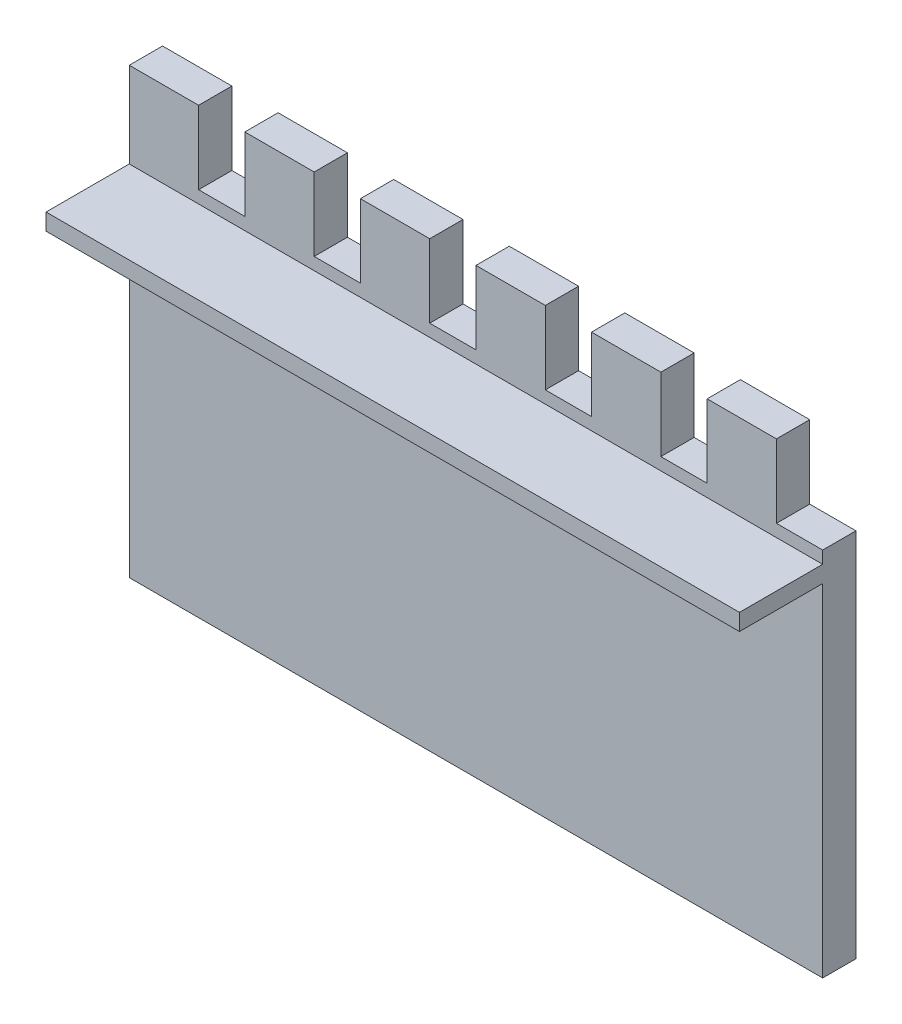
ISO-10303-21;
HEADER;
FILE_DESCRIPTION(('STEP AP214'),'2;1');
FILE_NAME('part.step','',(''),(''),'','','');
FILE_SCHEMA(('AUTOMOTIVE_DESIGN { 1 0 10303 214 1 1 1 1 }'));
ENDSEC;
DATA;
#1=APPLICATION_CONTEXT('core data for automotive mechanical design processes');
#2=APPLICATION_PROTOCOL_DEFINITION('international standard','automotive_design',2000,#1);
#3=PRODUCT_CONTEXT('',#1,'mechanical');
#4=PRODUCT('Part','Part','',(#3));
#5=PRODUCT_RELATED_PRODUCT_CATEGORY('part','',(#4));
#6=PRODUCT_DEFINITION_FORMATION('','',#4);
#7=PRODUCT_DEFINITION_CONTEXT('part definition',#1,'design');
#8=PRODUCT_DEFINITION('design','',#6,#7);
#9=PRODUCT_DEFINITION_SHAPE('','',#8);
#10=(LENGTH_UNIT() NAMED_UNIT(*) SI_UNIT(.MILLI.,.METRE.));
#11=(NAMED_UNIT(*) PLANE_ANGLE_UNIT() SI_UNIT($,.RADIAN.));
#12=(NAMED_UNIT(*) SI_UNIT($,.STERADIAN.) SOLID_ANGLE_UNIT());
#13=UNCERTAINTY_MEASURE_WITH_UNIT(LENGTH_MEASURE(1.E-05),#10,'distance_accuracy_value','');
#14=(GEOMETRIC_REPRESENTATION_CONTEXT(3) GLOBAL_UNCERTAINTY_ASSIGNED_CONTEXT((#13)) GLOBAL_UNIT_ASSIGNED_CONTEXT((#10,
#11,#12)) REPRESENTATION_CONTEXT('',''));
#15=CARTESIAN_POINT('',(0.,0.,0.));
#16=DIRECTION('',(0.,0.,1.));
#17=DIRECTION('',(1.,0.,0.));
#18=AXIS2_PLACEMENT_3D('',#15,#16,#17);
#19=CARTESIAN_POINT('',(0.,0.,1828.8));
#20=DIRECTION('',(0.,0.,-1.));
#21=DIRECTION('',(-1.,0.,0.));
#22=AXIS2_PLACEMENT_3D('',#19,#20,#21);
#23=PLANE('',#22);
#24=DIRECTION('',(-1.,0.,0.));
#25=VECTOR('',#24,1.);
#26=CARTESIAN_POINT('',(0.,19685.7089636422,1828.8));
#27=LINE('',#26,#25);
#28=CARTESIAN_POINT('',(38100.,19685.7089636422,1828.8));
#29=VERTEX_POINT('',#28);
#30=CARTESIAN_POINT('',(0.,19685.7089636422,1828.8));
#31=VERTEX_POINT('',#30);
#32=EDGE_CURVE('E51',#29,#31,#27,.T.);
#33=ORIENTED_EDGE('',*,*,#32,.F.);
#34=DIRECTION('',(0.,1.,0.));
#35=VECTOR('',#34,1.);
#36=CARTESIAN_POINT('',(38100.,0.,1828.8));
#37=LINE('',#36,#35);
#38=CARTESIAN_POINT('',(38100.,20364.7505525806,1828.8));
#39=VERTEX_POINT('',#38);
#40=EDGE_CURVE('E452',#29,#39,#37,.T.);
#41=ORIENTED_EDGE('',*,*,#40,.T.);
#42=DIRECTION('',(-1.,0.,0.));
#43=VECTOR('',#42,1.);
#44=CARTESIAN_POINT('',(-1.1393720921813E-10,20364.7505525804,1828.8));
#45=LINE('',#44,#43);
#46=CARTESIAN_POINT('',(35560.,20364.7505525806,1828.8));
#47=VERTEX_POINT('',#46);
#48=EDGE_CURVE('E256',#39,#47,#45,.T.);
#49=ORIENTED_EDGE('',*,*,#48,.T.);
#50=DIRECTION('',(0.,1.,0.));
#51=VECTOR('',#50,1.);
#52=CARTESIAN_POINT('',(35560.,0.,1828.8));
#53=LINE('',#52,#51);
#54=CARTESIAN_POINT('',(35560.,24384.,1828.8));
#55=VERTEX_POINT('',#54);
#56=EDGE_CURVE('E259',#47,#55,#53,.T.);
#57=ORIENTED_EDGE('',*,*,#56,.T.);
#58=DIRECTION('',(-1.,0.,0.));
#59=VECTOR('',#58,1.);
#60=CARTESIAN_POINT('',(0.,24384.,1828.8));
#61=LINE('',#60,#59);
#62=CARTESIAN_POINT('',(31750.,24384.,1828.8));
#63=VERTEX_POINT('',#62);
#64=EDGE_CURVE('E436',#55,#63,#61,.T.);
#65=ORIENTED_EDGE('',*,*,#64,.T.);
#66=DIRECTION('',(0.,-1.,0.));
#67=VECTOR('',#66,1.);
#68=CARTESIAN_POINT('',(31750.0000000001,8.4193823332617E-11,1828.8));
#69=LINE('',#68,#67);
#70=CARTESIAN_POINT('',(31750.,20364.7505525806,1828.8));
#71=VERTEX_POINT('',#70);
#72=EDGE_CURVE('E295',#63,#71,#69,.T.);
#73=ORIENTED_EDGE('',*,*,#72,.T.);
#74=DIRECTION('',(1.,0.,0.));
#75=VECTOR('',#74,1.);
#76=CARTESIAN_POINT('',(1.13937209218131E-10,20364.7505525808,1828.8));
#77=LINE('',#76,#75);
#78=CARTESIAN_POINT('',(29210.,20364.7505525806,1828.8));
#79=VERTEX_POINT('',#78);
#80=EDGE_CURVE('E304',#79,#71,#77,.T.);
#81=ORIENTED_EDGE('',*,*,#80,.F.);
#82=DIRECTION('',(0.,1.,0.));
#83=VECTOR('',#82,1.);
#84=CARTESIAN_POINT('',(29210.,0.,1828.8));
#85=LINE('',#84,#83);
#86=CARTESIAN_POINT('',(29210.,24384.,1828.8));
#87=VERTEX_POINT('',#86);
#88=EDGE_CURVE('E287',#79,#87,#85,.T.);
#89=ORIENTED_EDGE('',*,*,#88,.T.);
#90=CARTESIAN_POINT('',(25400.,24384.,1828.8));
#91=VERTEX_POINT('',#90);
#92=EDGE_CURVE('E447',#87,#91,#61,.T.);
#93=ORIENTED_EDGE('',*,*,#92,.T.);
#94=DIRECTION('',(0.,-1.,0.));
#95=VECTOR('',#94,1.);
#96=CARTESIAN_POINT('',(25400.,0.,1828.8));
#97=LINE('',#96,#95);
#98=CARTESIAN_POINT('',(25400.,20364.7505525806,1828.8));
#99=VERTEX_POINT('',#98);
#100=EDGE_CURVE('E328',#91,#99,#97,.T.);
#101=ORIENTED_EDGE('',*,*,#100,.T.);
#102=DIRECTION('',(-1.,0.,0.));
#103=VECTOR('',#102,1.);
#104=CARTESIAN_POINT('',(5.69686046090657E-11,20364.7505525807,1828.8));
#105=LINE('',#104,#103);
#106=CARTESIAN_POINT('',(22860.,20364.7505525806,1828.8));
#107=VERTEX_POINT('',#106);
#108=EDGE_CURVE('E311',#99,#107,#105,.T.);
#109=ORIENTED_EDGE('',*,*,#108,.T.);
#110=DIRECTION('',(0.,1.,0.));
#111=VECTOR('',#110,1.);
#112=CARTESIAN_POINT('',(22860.,0.,1828.8));
#113=LINE('',#112,#111);
#114=CARTESIAN_POINT('',(22860.,24384.,1828.8));
#115=VERTEX_POINT('',#114);
#116=EDGE_CURVE('E321',#107,#115,#113,.T.);
#117=ORIENTED_EDGE('',*,*,#116,.T.);
#118=CARTESIAN_POINT('',(19050.,24384.,1828.8));
#119=VERTEX_POINT('',#118);
#120=EDGE_CURVE('E817',#115,#119,#61,.T.);
#121=ORIENTED_EDGE('',*,*,#120,.T.);
#122=DIRECTION('',(0.,-1.,0.));
#123=VECTOR('',#122,1.);
#124=CARTESIAN_POINT('',(19050.,1.68387646665235E-11,1828.8));
#125=LINE('',#124,#123);
#126=CARTESIAN_POINT('',(19050.,20364.7505525806,1828.8));
#127=VERTEX_POINT('',#126);
#128=EDGE_CURVE('E347',#119,#127,#125,.T.);
#129=ORIENTED_EDGE('',*,*,#128,.T.);
#130=DIRECTION('',(1.,0.,0.));
#131=VECTOR('',#130,1.);
#132=CARTESIAN_POINT('',(-5.69686046090653E-11,20364.7505525806,1828.8));
#133=LINE('',#132,#131);
#134=CARTESIAN_POINT('',(16510.,20364.7505525806,1828.8));
#135=VERTEX_POINT('',#134);
#136=EDGE_CURVE('E356',#135,#127,#133,.T.);
#137=ORIENTED_EDGE('',*,*,#136,.F.);
#138=DIRECTION('',(0.,-1.,0.));
#139=VECTOR('',#138,1.);
#140=CARTESIAN_POINT('',(16510.,0.,1828.8));
#141=LINE('',#140,#139);
#142=CARTESIAN_POINT('',(16510.,24384.,1828.8));
#143=VERTEX_POINT('',#142);
#144=EDGE_CURVE('E336',#143,#135,#141,.T.);
#145=ORIENTED_EDGE('',*,*,#144,.F.);
#146=CARTESIAN_POINT('',(12700.,24384.,1828.8));
#147=VERTEX_POINT('',#146);
#148=EDGE_CURVE('E818',#143,#147,#61,.T.);
#149=ORIENTED_EDGE('',*,*,#148,.T.);
#150=DIRECTION('',(0.,-1.,0.));
#151=VECTOR('',#150,1.);
#152=CARTESIAN_POINT('',(12700.,-5.6129215555078E-12,1828.8));
#153=LINE('',#152,#151);
#154=CARTESIAN_POINT('',(12700.,20364.7505525806,1828.8));
#155=VERTEX_POINT('',#154);
#156=EDGE_CURVE('E380',#147,#155,#153,.T.);
#157=ORIENTED_EDGE('',*,*,#156,.T.);
#158=DIRECTION('',(-1.,0.,0.));
#159=VECTOR('',#158,1.);
#160=CARTESIAN_POINT('',(2.27874418436264E-10,20364.7505525807,1828.8));
#161=LINE('',#160,#159);
#162=CARTESIAN_POINT('',(10160.,20364.7505525806,1828.8));
#163=VERTEX_POINT('',#162);
#164=EDGE_CURVE('E363',#155,#163,#161,.T.);
#165=ORIENTED_EDGE('',*,*,#164,.T.);
#166=DIRECTION('',(0.,1.,0.));
#167=VECTOR('',#166,1.);
#168=CARTESIAN_POINT('',(10160.,0.,1828.8));
#169=LINE('',#168,#167);
#170=CARTESIAN_POINT('',(10160.,24384.,1828.8));
#171=VERTEX_POINT('',#170);
#172=EDGE_CURVE('E373',#163,#171,#169,.T.);
#173=ORIENTED_EDGE('',*,*,#172,.T.);
#174=CARTESIAN_POINT('',(6350.,24384.,1828.8));
#175=VERTEX_POINT('',#174);
#176=EDGE_CURVE('E456',#171,#175,#61,.T.);
#177=ORIENTED_EDGE('',*,*,#176,.T.);
#178=DIRECTION('',(0.,-1.,0.));
#179=VECTOR('',#178,1.);
#180=CARTESIAN_POINT('',(6350.00000000001,1.40323038887696E-12,1828.8));
#181=LINE('',#180,#179);
#182=CARTESIAN_POINT('',(6350.,20364.7505525806,1828.8));
#183=VERTEX_POINT('',#182);
#184=EDGE_CURVE('E398',#175,#183,#181,.T.);
#185=ORIENTED_EDGE('',*,*,#184,.T.);
#186=DIRECTION('',(1.,0.,0.));
#187=VECTOR('',#186,1.);
#188=CARTESIAN_POINT('',(-2.27874418436261E-10,20364.7505525806,1828.8));
#189=LINE('',#188,#187);
#190=CARTESIAN_POINT('',(3810.,20364.7505525806,1828.8));
#191=VERTEX_POINT('',#190);
#192=EDGE_CURVE('E407',#191,#183,#189,.T.);
#193=ORIENTED_EDGE('',*,*,#192,.F.);
#194=DIRECTION('',(0.,1.,0.));
#195=VECTOR('',#194,1.);
#196=CARTESIAN_POINT('',(3810.,0.,1828.8));
#197=LINE('',#196,#195);
#198=CARTESIAN_POINT('',(3810.,24384.,1828.8));
#199=VERTEX_POINT('',#198);
#200=EDGE_CURVE('E388',#191,#199,#197,.T.);
#201=ORIENTED_EDGE('',*,*,#200,.T.);
#202=CARTESIAN_POINT('',(0.,24384.,1828.8));
#203=VERTEX_POINT('',#202);
#204=EDGE_CURVE('E448',#199,#203,#61,.T.);
#205=ORIENTED_EDGE('',*,*,#204,.T.);
#206=DIRECTION('',(0.,-1.,0.));
#207=VECTOR('',#206,1.);
#208=CARTESIAN_POINT('',(0.,0.,1828.8));
#209=LINE('',#208,#207);
#210=EDGE_CURVE('E429',#203,#31,#209,.T.);
#211=ORIENTED_EDGE('',*,*,#210,.T.);
#212=EDGE_LOOP('',(#33,#41,#49,#57,#65,#73,#81,#89,#93,#101,#109,#117,#121,#129,#137,#145,#149,
#157,#165,#173,#177,#185,#193,#201,#205,#211));
#213=FACE_BOUND('',#212,.T.);
#214=ADVANCED_FACE('F34',(#213),#23,.F.);
#215=DIRECTION('',(1.,0.,0.));
#216=VECTOR('',#215,1.);
#217=CARTESIAN_POINT('',(38100.,18771.3089636422,1828.8));
#218=LINE('',#217,#216);
#219=CARTESIAN_POINT('',(0.,18771.3089636422,1828.8));
#220=VERTEX_POINT('',#219);
#221=CARTESIAN_POINT('',(38100.,18771.3089636422,1828.8));
#222=VERTEX_POINT('',#221);
#223=EDGE_CURVE('E59',#220,#222,#218,.T.);
#224=ORIENTED_EDGE('',*,*,#223,.F.);
#225=CARTESIAN_POINT('',(0.,0.,1828.8));
#226=VERTEX_POINT('',#225);
#227=EDGE_CURVE('E255',#220,#226,#209,.T.);
#228=ORIENTED_EDGE('',*,*,#227,.T.);
#229=DIRECTION('',(1.,0.,0.));
#230=VECTOR('',#229,1.);
#231=CARTESIAN_POINT('',(0.,0.,1828.8));
#232=LINE('',#231,#230);
#233=CARTESIAN_POINT('',(38100.,0.,1828.8));
#234=VERTEX_POINT('',#233);
#235=EDGE_CURVE('E423',#226,#234,#232,.T.);
#236=ORIENTED_EDGE('',*,*,#235,.T.);
#237=EDGE_CURVE('E454',#234,#222,#37,.T.);
#238=ORIENTED_EDGE('',*,*,#237,.T.);
#239=EDGE_LOOP('',(#224,#228,#236,#238));
#240=FACE_BOUND('',#239,.T.);
#241=ADVANCED_FACE('F460',(#240),#23,.F.);
#242=CARTESIAN_POINT('',(0.,24384.,1828.8));
#243=DIRECTION('',(0.,-1.,0.));
#244=DIRECTION('',(0.,0.,-1.));
#245=AXIS2_PLACEMENT_3D('',#242,#243,#244);
#246=PLANE('',#245);
#247=DIRECTION('',(0.,0.,1.));
#248=VECTOR('',#247,1.);
#249=CARTESIAN_POINT('',(35560.,24384.,0.));
#250=LINE('',#249,#248);
#251=CARTESIAN_POINT('',(35560.,24384.,0.));
#252=VERTEX_POINT('',#251);
#253=EDGE_CURVE('E288',#252,#55,#250,.T.);
#254=ORIENTED_EDGE('',*,*,#253,.F.);
#255=DIRECTION('',(-1.,0.,0.));
#256=VECTOR('',#255,1.);
#257=CARTESIAN_POINT('',(0.,24384.,0.));
#258=LINE('',#257,#256);
#259=CARTESIAN_POINT('',(31750.,24384.,0.));
#260=VERTEX_POINT('',#259);
#261=EDGE_CURVE('E437',#252,#260,#258,.T.);
#262=ORIENTED_EDGE('',*,*,#261,.T.);
#263=DIRECTION('',(0.,0.,1.));
#264=VECTOR('',#263,1.);
#265=CARTESIAN_POINT('',(31750.,24384.,0.));
#266=LINE('',#265,#264);
#267=EDGE_CURVE('E312',#260,#63,#266,.T.);
#268=ORIENTED_EDGE('',*,*,#267,.T.);
#269=ORIENTED_EDGE('',*,*,#64,.F.);
#270=EDGE_LOOP('',(#254,#262,#268,#269));
#271=FACE_BOUND('',#270,.T.);
#272=ADVANCED_FACE('F487',(#271),#246,.F.);
#273=CARTESIAN_POINT('',(0.,0.,0.));
#274=DIRECTION('',(0.,0.,-1.));
#275=DIRECTION('',(-1.,0.,0.));
#276=AXIS2_PLACEMENT_3D('',#273,#274,#275);
#277=PLANE('',#276);
#278=DIRECTION('',(0.,1.,0.));
#279=VECTOR('',#278,1.);
#280=CARTESIAN_POINT('',(35560.,0.,0.));
#281=LINE('',#280,#279);
#282=CARTESIAN_POINT('',(35560.,20364.7505525806,0.));
#283=VERTEX_POINT('',#282);
#284=EDGE_CURVE('E279',#283,#252,#281,.T.);
#285=ORIENTED_EDGE('',*,*,#284,.F.);
#286=DIRECTION('',(-1.,0.,0.));
#287=VECTOR('',#286,1.);
#288=CARTESIAN_POINT('',(-1.1393720921813E-10,20364.7505525804,0.));
#289=LINE('',#288,#287);
#290=CARTESIAN_POINT('',(38100.,20364.7505525806,0.));
#291=VERTEX_POINT('',#290);
#292=EDGE_CURVE('E277',#291,#283,#289,.T.);
#293=ORIENTED_EDGE('',*,*,#292,.F.);
#294=DIRECTION('',(0.,1.,0.));
#295=VECTOR('',#294,1.);
#296=CARTESIAN_POINT('',(38100.,0.,0.));
#297=LINE('',#296,#295);
#298=CARTESIAN_POINT('',(38100.,0.,0.));
#299=VERTEX_POINT('',#298);
#300=EDGE_CURVE('E441',#299,#291,#297,.T.);
#301=ORIENTED_EDGE('',*,*,#300,.F.);
#302=DIRECTION('',(1.,0.,0.));
#303=VECTOR('',#302,1.);
#304=CARTESIAN_POINT('',(0.,0.,0.));
#305=LINE('',#304,#303);
#306=CARTESIAN_POINT('',(0.,0.,0.));
#307=VERTEX_POINT('',#306);
#308=EDGE_CURVE('E444',#307,#299,#305,.T.);
#309=ORIENTED_EDGE('',*,*,#308,.F.);
#310=DIRECTION('',(0.,-1.,0.));
#311=VECTOR('',#310,1.);
#312=CARTESIAN_POINT('',(0.,0.,0.));
#313=LINE('',#312,#311);
#314=CARTESIAN_POINT('',(0.,24384.,0.));
#315=VERTEX_POINT('',#314);
#316=EDGE_CURVE('E414',#315,#307,#313,.T.);
#317=ORIENTED_EDGE('',*,*,#316,.F.);
#318=CARTESIAN_POINT('',(3810.,24384.,0.));
#319=VERTEX_POINT('',#318);
#320=EDGE_CURVE('E440',#319,#315,#258,.T.);
#321=ORIENTED_EDGE('',*,*,#320,.F.);
#322=DIRECTION('',(0.,1.,0.));
#323=VECTOR('',#322,1.);
#324=CARTESIAN_POINT('',(3810.,0.,0.));
#325=LINE('',#324,#323);
#326=CARTESIAN_POINT('',(3810.,20364.7505525806,0.));
#327=VERTEX_POINT('',#326);
#328=EDGE_CURVE('E395',#327,#319,#325,.T.);
#329=ORIENTED_EDGE('',*,*,#328,.F.);
#330=DIRECTION('',(1.,0.,0.));
#331=VECTOR('',#330,1.);
#332=CARTESIAN_POINT('',(-2.27874418436261E-10,20364.7505525806,0.));
#333=LINE('',#332,#331);
#334=CARTESIAN_POINT('',(6350.,20364.7505525806,0.));
#335=VERTEX_POINT('',#334);
#336=EDGE_CURVE('E397',#327,#335,#333,.T.);
#337=ORIENTED_EDGE('',*,*,#336,.T.);
#338=DIRECTION('',(0.,-1.,0.));
#339=VECTOR('',#338,1.);
#340=CARTESIAN_POINT('',(6350.00000000001,1.40323038887696E-12,0.));
#341=LINE('',#340,#339);
#342=CARTESIAN_POINT('',(6350.,24384.,0.));
#343=VERTEX_POINT('',#342);
#344=EDGE_CURVE('E401',#343,#335,#341,.T.);
#345=ORIENTED_EDGE('',*,*,#344,.F.);
#346=CARTESIAN_POINT('',(10160.,24384.,0.));
#347=VERTEX_POINT('',#346);
#348=EDGE_CURVE('E789',#347,#343,#258,.T.);
#349=ORIENTED_EDGE('',*,*,#348,.F.);
#350=DIRECTION('',(0.,1.,0.));
#351=VECTOR('',#350,1.);
#352=CARTESIAN_POINT('',(10160.,0.,0.));
#353=LINE('',#352,#351);
#354=CARTESIAN_POINT('',(10160.,20364.7505525806,0.));
#355=VERTEX_POINT('',#354);
#356=EDGE_CURVE('E375',#355,#347,#353,.T.);
#357=ORIENTED_EDGE('',*,*,#356,.F.);
#358=DIRECTION('',(-1.,0.,0.));
#359=VECTOR('',#358,1.);
#360=CARTESIAN_POINT('',(2.27874418436264E-10,20364.7505525807,0.));
#361=LINE('',#360,#359);
#362=CARTESIAN_POINT('',(12700.,20364.7505525806,0.));
#363=VERTEX_POINT('',#362);
#364=EDGE_CURVE('E370',#363,#355,#361,.T.);
#365=ORIENTED_EDGE('',*,*,#364,.F.);
#366=DIRECTION('',(0.,-1.,0.));
#367=VECTOR('',#366,1.);
#368=CARTESIAN_POINT('',(12700.,-5.6129215555078E-12,0.));
#369=LINE('',#368,#367);
#370=CARTESIAN_POINT('',(12700.,24384.,0.));
#371=VERTEX_POINT('',#370);
#372=EDGE_CURVE('E372',#371,#363,#369,.T.);
#373=ORIENTED_EDGE('',*,*,#372,.F.);
#374=CARTESIAN_POINT('',(16510.,24384.,0.));
#375=VERTEX_POINT('',#374);
#376=EDGE_CURVE('E791',#375,#371,#258,.T.);
#377=ORIENTED_EDGE('',*,*,#376,.F.);
#378=DIRECTION('',(0.,-1.,0.));
#379=VECTOR('',#378,1.);
#380=CARTESIAN_POINT('',(16510.,0.,0.));
#381=LINE('',#380,#379);
#382=CARTESIAN_POINT('',(16510.,20364.7505525806,0.));
#383=VERTEX_POINT('',#382);
#384=EDGE_CURVE('E343',#375,#383,#381,.T.);
#385=ORIENTED_EDGE('',*,*,#384,.T.);
#386=DIRECTION('',(1.,0.,0.));
#387=VECTOR('',#386,1.);
#388=CARTESIAN_POINT('',(-5.69686046090653E-11,20364.7505525806,0.));
#389=LINE('',#388,#387);
#390=CARTESIAN_POINT('',(19050.,20364.7505525806,0.));
#391=VERTEX_POINT('',#390);
#392=EDGE_CURVE('E346',#383,#391,#389,.T.);
#393=ORIENTED_EDGE('',*,*,#392,.T.);
#394=DIRECTION('',(0.,-1.,0.));
#395=VECTOR('',#394,1.);
#396=CARTESIAN_POINT('',(19050.,1.68387646665235E-11,0.));
#397=LINE('',#396,#395);
#398=CARTESIAN_POINT('',(19050.,24384.,0.));
#399=VERTEX_POINT('',#398);
#400=EDGE_CURVE('E350',#399,#391,#397,.T.);
#401=ORIENTED_EDGE('',*,*,#400,.F.);
#402=CARTESIAN_POINT('',(22860.,24384.,0.));
#403=VERTEX_POINT('',#402);
#404=EDGE_CURVE('E792',#403,#399,#258,.T.);
#405=ORIENTED_EDGE('',*,*,#404,.F.);
#406=DIRECTION('',(0.,1.,0.));
#407=VECTOR('',#406,1.);
#408=CARTESIAN_POINT('',(22860.,0.,0.));
#409=LINE('',#408,#407);
#410=CARTESIAN_POINT('',(22860.,20364.7505525806,0.));
#411=VERTEX_POINT('',#410);
#412=EDGE_CURVE('E323',#411,#403,#409,.T.);
#413=ORIENTED_EDGE('',*,*,#412,.F.);
#414=DIRECTION('',(-1.,0.,0.));
#415=VECTOR('',#414,1.);
#416=CARTESIAN_POINT('',(5.69686046090657E-11,20364.7505525807,0.));
#417=LINE('',#416,#415);
#418=CARTESIAN_POINT('',(25400.,20364.7505525806,0.));
#419=VERTEX_POINT('',#418);
#420=EDGE_CURVE('E318',#419,#411,#417,.T.);
#421=ORIENTED_EDGE('',*,*,#420,.F.);
#422=DIRECTION('',(0.,-1.,0.));
#423=VECTOR('',#422,1.);
#424=CARTESIAN_POINT('',(25400.,0.,0.));
#425=LINE('',#424,#423);
#426=CARTESIAN_POINT('',(25400.,24384.,0.));
#427=VERTEX_POINT('',#426);
#428=EDGE_CURVE('E320',#427,#419,#425,.T.);
#429=ORIENTED_EDGE('',*,*,#428,.F.);
#430=CARTESIAN_POINT('',(29210.,24384.,0.));
#431=VERTEX_POINT('',#430);
#432=EDGE_CURVE('E439',#431,#427,#258,.T.);
#433=ORIENTED_EDGE('',*,*,#432,.F.);
#434=DIRECTION('',(0.,1.,0.));
#435=VECTOR('',#434,1.);
#436=CARTESIAN_POINT('',(29210.,0.,0.));
#437=LINE('',#436,#435);
#438=CARTESIAN_POINT('',(29210.,20364.7505525806,0.));
#439=VERTEX_POINT('',#438);
#440=EDGE_CURVE('E292',#439,#431,#437,.T.);
#441=ORIENTED_EDGE('',*,*,#440,.F.);
#442=DIRECTION('',(1.,0.,0.));
#443=VECTOR('',#442,1.);
#444=CARTESIAN_POINT('',(1.13937209218131E-10,20364.7505525808,0.));
#445=LINE('',#444,#443);
#446=CARTESIAN_POINT('',(31750.,20364.7505525806,0.));
#447=VERTEX_POINT('',#446);
#448=EDGE_CURVE('E294',#439,#447,#445,.T.);
#449=ORIENTED_EDGE('',*,*,#448,.T.);
#450=DIRECTION('',(0.,-1.,0.));
#451=VECTOR('',#450,1.);
#452=CARTESIAN_POINT('',(31750.0000000001,8.4193823332617E-11,0.));
#453=LINE('',#452,#451);
#454=EDGE_CURVE('E298',#260,#447,#453,.T.);
#455=ORIENTED_EDGE('',*,*,#454,.F.);
#456=ORIENTED_EDGE('',*,*,#261,.F.);
#457=EDGE_LOOP('',(#285,#293,#301,#309,#317,#321,#329,#337,#345,#349,#357,#365,#373,#377,#385,
#393,#401,#405,#413,#421,#429,#433,#441,#449,#455,#456));
#458=FACE_BOUND('',#457,.T.);
#459=ADVANCED_FACE('F492',(#458),#277,.T.);
#460=CARTESIAN_POINT('',(38100.,0.,1828.8));
#461=DIRECTION('',(-1.,0.,0.));
#462=DIRECTION('',(0.,0.,1.));
#463=AXIS2_PLACEMENT_3D('',#460,#461,#462);
#464=PLANE('',#463);
#465=DIRECTION('',(0.,0.,1.));
#466=VECTOR('',#465,1.);
#467=CARTESIAN_POINT('',(38100.,20364.7505525806,0.));
#468=LINE('',#467,#466);
#469=EDGE_CURVE('E280',#291,#39,#468,.T.);
#470=ORIENTED_EDGE('',*,*,#469,.T.);
#471=ORIENTED_EDGE('',*,*,#40,.F.);
#472=DIRECTION('',(0.,0.,-1.));
#473=VECTOR('',#472,1.);
#474=CARTESIAN_POINT('',(38100.,19685.7089636422,6400.8));
#475=LINE('',#474,#473);
#476=CARTESIAN_POINT('',(38100.,19685.7089636422,6400.8));
#477=VERTEX_POINT('',#476);
#478=EDGE_CURVE('E261',#477,#29,#475,.T.);
#479=ORIENTED_EDGE('',*,*,#478,.F.);
#480=DIRECTION('',(0.,1.,0.));
#481=VECTOR('',#480,1.);
#482=CARTESIAN_POINT('',(38100.,19685.7089636422,6400.8));
#483=LINE('',#482,#481);
#484=CARTESIAN_POINT('',(38100.,18771.3089636422,6400.8));
#485=VERTEX_POINT('',#484);
#486=EDGE_CURVE('E242',#485,#477,#483,.T.);
#487=ORIENTED_EDGE('',*,*,#486,.F.);
#488=DIRECTION('',(0.,0.,-1.));
#489=VECTOR('',#488,1.);
#490=CARTESIAN_POINT('',(38100.,18771.3089636422,6400.8));
#491=LINE('',#490,#489);
#492=EDGE_CURVE('E239',#485,#222,#491,.T.);
#493=ORIENTED_EDGE('',*,*,#492,.T.);
#494=ORIENTED_EDGE('',*,*,#237,.F.);
#495=DIRECTION('',(0.,0.,-1.));
#496=VECTOR('',#495,1.);
#497=CARTESIAN_POINT('',(38100.,0.,1828.8));
#498=LINE('',#497,#496);
#499=EDGE_CURVE('E43',#234,#299,#498,.T.);
#500=ORIENTED_EDGE('',*,*,#499,.T.);
#501=ORIENTED_EDGE('',*,*,#300,.T.);
#502=EDGE_LOOP('',(#470,#471,#479,#487,#493,#494,#500,#501));
#503=FACE_BOUND('',#502,.T.);
#504=ADVANCED_FACE('F465',(#503),#464,.F.);
#505=DIRECTION('',(0.,0.,1.));
#506=VECTOR('',#505,1.);
#507=CARTESIAN_POINT('',(29210.,24384.,0.));
#508=LINE('',#507,#506);
#509=EDGE_CURVE('E309',#431,#87,#508,.T.);
#510=ORIENTED_EDGE('',*,*,#509,.F.);
#511=ORIENTED_EDGE('',*,*,#432,.T.);
#512=DIRECTION('',(0.,0.,1.));
#513=VECTOR('',#512,1.);
#514=CARTESIAN_POINT('',(25400.,24384.,0.));
#515=LINE('',#514,#513);
#516=EDGE_CURVE('E339',#427,#91,#515,.T.);
#517=ORIENTED_EDGE('',*,*,#516,.T.);
#518=ORIENTED_EDGE('',*,*,#92,.F.);
#519=EDGE_LOOP('',(#510,#511,#517,#518));
#520=FACE_BOUND('',#519,.T.);
#521=ADVANCED_FACE('F502',(#520),#246,.F.);
#522=DIRECTION('',(0.,0.,1.));
#523=VECTOR('',#522,1.);
#524=CARTESIAN_POINT('',(22860.,24384.,0.));
#525=LINE('',#524,#523);
#526=EDGE_CURVE('E337',#403,#115,#525,.T.);
#527=ORIENTED_EDGE('',*,*,#526,.F.);
#528=ORIENTED_EDGE('',*,*,#404,.T.);
#529=DIRECTION('',(0.,0.,1.));
#530=VECTOR('',#529,1.);
#531=CARTESIAN_POINT('',(19050.,24384.,0.));
#532=LINE('',#531,#530);
#533=EDGE_CURVE('E364',#399,#119,#532,.T.);
#534=ORIENTED_EDGE('',*,*,#533,.T.);
#535=ORIENTED_EDGE('',*,*,#120,.F.);
#536=EDGE_LOOP('',(#527,#528,#534,#535));
#537=FACE_BOUND('',#536,.T.);
#538=ADVANCED_FACE('F532',(#537),#246,.F.);
#539=DIRECTION('',(0.,0.,1.));
#540=VECTOR('',#539,1.);
#541=CARTESIAN_POINT('',(10160.,24384.,0.));
#542=LINE('',#541,#540);
#543=EDGE_CURVE('E389',#347,#171,#542,.T.);
#544=ORIENTED_EDGE('',*,*,#543,.F.);
#545=ORIENTED_EDGE('',*,*,#348,.T.);
#546=DIRECTION('',(0.,0.,1.));
#547=VECTOR('',#546,1.);
#548=CARTESIAN_POINT('',(6350.,24384.,0.));
#549=LINE('',#548,#547);
#550=EDGE_CURVE('E415',#343,#175,#549,.T.);
#551=ORIENTED_EDGE('',*,*,#550,.T.);
#552=ORIENTED_EDGE('',*,*,#176,.F.);
#553=EDGE_LOOP('',(#544,#545,#551,#552));
#554=FACE_BOUND('',#553,.T.);
#555=ADVANCED_FACE('F525',(#554),#246,.F.);
#556=ORIENTED_EDGE('',*,*,#148,.F.);
#557=DIRECTION('',(0.,0.,1.));
#558=VECTOR('',#557,1.);
#559=CARTESIAN_POINT('',(16510.,24384.,0.));
#560=LINE('',#559,#558);
#561=EDGE_CURVE('E361',#375,#143,#560,.T.);
#562=ORIENTED_EDGE('',*,*,#561,.F.);
#563=ORIENTED_EDGE('',*,*,#376,.T.);
#564=DIRECTION('',(0.,0.,1.));
#565=VECTOR('',#564,1.);
#566=CARTESIAN_POINT('',(12700.,24384.,0.));
#567=LINE('',#566,#565);
#568=EDGE_CURVE('E391',#371,#147,#567,.T.);
#569=ORIENTED_EDGE('',*,*,#568,.T.);
#570=EDGE_LOOP('',(#556,#562,#563,#569));
#571=FACE_BOUND('',#570,.T.);
#572=ADVANCED_FACE('F499',(#571),#246,.F.);
#573=DIRECTION('',(0.,0.,1.));
#574=VECTOR('',#573,1.);
#575=CARTESIAN_POINT('',(3810.,24384.,0.));
#576=LINE('',#575,#574);
#577=EDGE_CURVE('E412',#319,#199,#576,.T.);
#578=ORIENTED_EDGE('',*,*,#577,.F.);
#579=ORIENTED_EDGE('',*,*,#320,.T.);
#580=DIRECTION('',(0.,0.,-1.));
#581=VECTOR('',#580,1.);
#582=CARTESIAN_POINT('',(0.,24384.,1828.8));
#583=LINE('',#582,#581);
#584=EDGE_CURVE('E433',#203,#315,#583,.T.);
#585=ORIENTED_EDGE('',*,*,#584,.F.);
#586=ORIENTED_EDGE('',*,*,#204,.F.);
#587=EDGE_LOOP('',(#578,#579,#585,#586));
#588=FACE_BOUND('',#587,.T.);
#589=ADVANCED_FACE('F496',(#588),#246,.F.);
#590=CARTESIAN_POINT('',(0.,0.,1828.8));
#591=DIRECTION('',(1.,0.,0.));
#592=DIRECTION('',(0.,0.,-1.));
#593=AXIS2_PLACEMENT_3D('',#590,#591,#592);
#594=PLANE('',#593);
#595=ORIENTED_EDGE('',*,*,#316,.T.);
#596=DIRECTION('',(0.,0.,-1.));
#597=VECTOR('',#596,1.);
#598=CARTESIAN_POINT('',(0.,0.,1828.8));
#599=LINE('',#598,#597);
#600=EDGE_CURVE('E11',#226,#307,#599,.T.);
#601=ORIENTED_EDGE('',*,*,#600,.F.);
#602=ORIENTED_EDGE('',*,*,#227,.F.);
#603=DIRECTION('',(0.,0.,-1.));
#604=VECTOR('',#603,1.);
#605=CARTESIAN_POINT('',(0.,18771.3089636422,6400.8));
#606=LINE('',#605,#604);
#607=CARTESIAN_POINT('',(0.,18771.3089636422,6400.8));
#608=VERTEX_POINT('',#607);
#609=EDGE_CURVE('E237',#608,#220,#606,.T.);
#610=ORIENTED_EDGE('',*,*,#609,.F.);
#611=DIRECTION('',(0.,-1.,0.));
#612=VECTOR('',#611,1.);
#613=CARTESIAN_POINT('',(0.,18771.3089636422,6400.8));
#614=LINE('',#613,#612);
#615=CARTESIAN_POINT('',(0.,19685.7089636422,6400.8));
#616=VERTEX_POINT('',#615);
#617=EDGE_CURVE('E243',#616,#608,#614,.T.);
#618=ORIENTED_EDGE('',*,*,#617,.F.);
#619=DIRECTION('',(0.,0.,-1.));
#620=VECTOR('',#619,1.);
#621=CARTESIAN_POINT('',(0.,19685.7089636422,6400.8));
#622=LINE('',#621,#620);
#623=EDGE_CURVE('E270',#616,#31,#622,.T.);
#624=ORIENTED_EDGE('',*,*,#623,.T.);
#625=ORIENTED_EDGE('',*,*,#210,.F.);
#626=ORIENTED_EDGE('',*,*,#584,.T.);
#627=EDGE_LOOP('',(#595,#601,#602,#610,#618,#624,#625,#626));
#628=FACE_BOUND('',#627,.T.);
#629=ADVANCED_FACE('F36',(#628),#594,.F.);
#630=CARTESIAN_POINT('',(0.,0.,1828.8));
#631=DIRECTION('',(0.,1.,0.));
#632=DIRECTION('',(0.,0.,1.));
#633=AXIS2_PLACEMENT_3D('',#630,#631,#632);
#634=PLANE('',#633);
#635=ORIENTED_EDGE('',*,*,#308,.T.);
#636=ORIENTED_EDGE('',*,*,#499,.F.);
#637=ORIENTED_EDGE('',*,*,#235,.F.);
#638=ORIENTED_EDGE('',*,*,#600,.T.);
#639=EDGE_LOOP('',(#635,#636,#637,#638));
#640=FACE_BOUND('',#639,.T.);
#641=ADVANCED_FACE('F462',(#640),#634,.F.);
#642=CARTESIAN_POINT('',(3810.,0.,0.));
#643=DIRECTION('',(1.,0.,0.));
#644=DIRECTION('',(0.,0.,-1.));
#645=AXIS2_PLACEMENT_3D('',#642,#643,#644);
#646=PLANE('',#645);
#647=ORIENTED_EDGE('',*,*,#200,.F.);
#648=DIRECTION('',(0.,0.,1.));
#649=VECTOR('',#648,1.);
#650=CARTESIAN_POINT('',(3810.,20364.7505525806,0.));
#651=LINE('',#650,#649);
#652=EDGE_CURVE('E404',#327,#191,#651,.T.);
#653=ORIENTED_EDGE('',*,*,#652,.F.);
#654=ORIENTED_EDGE('',*,*,#328,.T.);
#655=ORIENTED_EDGE('',*,*,#577,.T.);
#656=EDGE_LOOP('',(#647,#653,#654,#655));
#657=FACE_BOUND('',#656,.T.);
#658=ADVANCED_FACE('F490',(#657),#646,.T.);
#659=CARTESIAN_POINT('',(6350.00000000001,1.40323038887696E-12,0.));
#660=DIRECTION('',(-1.,0.,0.));
#661=DIRECTION('',(0.,-1.,0.));
#662=AXIS2_PLACEMENT_3D('',#659,#660,#661);
#663=PLANE('',#662);
#664=ORIENTED_EDGE('',*,*,#184,.F.);
#665=ORIENTED_EDGE('',*,*,#550,.F.);
#666=ORIENTED_EDGE('',*,*,#344,.T.);
#667=DIRECTION('',(0.,0.,1.));
#668=VECTOR('',#667,1.);
#669=CARTESIAN_POINT('',(6350.,20364.7505525806,0.));
#670=LINE('',#669,#668);
#671=EDGE_CURVE('E418',#335,#183,#670,.T.);
#672=ORIENTED_EDGE('',*,*,#671,.T.);
#673=EDGE_LOOP('',(#664,#665,#666,#672));
#674=FACE_BOUND('',#673,.T.);
#675=ADVANCED_FACE('F508',(#674),#663,.T.);
#676=CARTESIAN_POINT('',(-2.27874418436261E-10,20364.7505525806,0.));
#677=DIRECTION('',(0.,-1.,0.));
#678=DIRECTION('',(1.,0.,0.));
#679=AXIS2_PLACEMENT_3D('',#676,#677,#678);
#680=PLANE('',#679);
#681=ORIENTED_EDGE('',*,*,#192,.T.);
#682=ORIENTED_EDGE('',*,*,#671,.F.);
#683=ORIENTED_EDGE('',*,*,#336,.F.);
#684=ORIENTED_EDGE('',*,*,#652,.T.);
#685=EDGE_LOOP('',(#681,#682,#683,#684));
#686=FACE_BOUND('',#685,.T.);
#687=ADVANCED_FACE('F706',(#686),#680,.F.);
#688=CARTESIAN_POINT('',(2.27874418436264E-10,20364.7505525807,0.));
#689=DIRECTION('',(0.,1.,0.));
#690=DIRECTION('',(-1.,0.,0.));
#691=AXIS2_PLACEMENT_3D('',#688,#689,#690);
#692=PLANE('',#691);
#693=ORIENTED_EDGE('',*,*,#164,.F.);
#694=DIRECTION('',(0.,0.,1.));
#695=VECTOR('',#694,1.);
#696=CARTESIAN_POINT('',(12700.,20364.7505525806,0.));
#697=LINE('',#696,#695);
#698=EDGE_CURVE('E377',#363,#155,#697,.T.);
#699=ORIENTED_EDGE('',*,*,#698,.F.);
#700=ORIENTED_EDGE('',*,*,#364,.T.);
#701=DIRECTION('',(0.,0.,1.));
#702=VECTOR('',#701,1.);
#703=CARTESIAN_POINT('',(10160.,20364.7505525806,0.));
#704=LINE('',#703,#702);
#705=EDGE_CURVE('E385',#355,#163,#704,.T.);
#706=ORIENTED_EDGE('',*,*,#705,.T.);
#707=EDGE_LOOP('',(#693,#699,#700,#706));
#708=FACE_BOUND('',#707,.T.);
#709=ADVANCED_FACE('F698',(#708),#692,.T.);
#710=CARTESIAN_POINT('',(10160.,0.,0.));
#711=DIRECTION('',(1.,0.,0.));
#712=DIRECTION('',(0.,0.,-1.));
#713=AXIS2_PLACEMENT_3D('',#710,#711,#712);
#714=PLANE('',#713);
#715=ORIENTED_EDGE('',*,*,#172,.F.);
#716=ORIENTED_EDGE('',*,*,#705,.F.);
#717=ORIENTED_EDGE('',*,*,#356,.T.);
#718=ORIENTED_EDGE('',*,*,#543,.T.);
#719=EDGE_LOOP('',(#715,#716,#717,#718));
#720=FACE_BOUND('',#719,.T.);
#721=ADVANCED_FACE('F690',(#720),#714,.T.);
#722=CARTESIAN_POINT('',(12700.,-5.6129215555078E-12,0.));
#723=DIRECTION('',(-1.,0.,0.));
#724=DIRECTION('',(0.,-1.,0.));
#725=AXIS2_PLACEMENT_3D('',#722,#723,#724);
#726=PLANE('',#725);
#727=ORIENTED_EDGE('',*,*,#156,.F.);
#728=ORIENTED_EDGE('',*,*,#568,.F.);
#729=ORIENTED_EDGE('',*,*,#372,.T.);
#730=ORIENTED_EDGE('',*,*,#698,.T.);
#731=EDGE_LOOP('',(#727,#728,#729,#730));
#732=FACE_BOUND('',#731,.T.);
#733=ADVANCED_FACE('F682',(#732),#726,.T.);
#734=CARTESIAN_POINT('',(16510.,0.,0.));
#735=DIRECTION('',(-1.,0.,0.));
#736=DIRECTION('',(0.,0.,1.));
#737=AXIS2_PLACEMENT_3D('',#734,#735,#736);
#738=PLANE('',#737);
#739=ORIENTED_EDGE('',*,*,#144,.T.);
#740=DIRECTION('',(0.,0.,1.));
#741=VECTOR('',#740,1.);
#742=CARTESIAN_POINT('',(16510.,20364.7505525806,0.));
#743=LINE('',#742,#741);
#744=EDGE_CURVE('E353',#383,#135,#743,.T.);
#745=ORIENTED_EDGE('',*,*,#744,.F.);
#746=ORIENTED_EDGE('',*,*,#384,.F.);
#747=ORIENTED_EDGE('',*,*,#561,.T.);
#748=EDGE_LOOP('',(#739,#745,#746,#747));
#749=FACE_BOUND('',#748,.T.);
#750=ADVANCED_FACE('F674',(#749),#738,.F.);
#751=CARTESIAN_POINT('',(19050.,1.68387646665235E-11,0.));
#752=DIRECTION('',(-1.,0.,0.));
#753=DIRECTION('',(0.,-1.,0.));
#754=AXIS2_PLACEMENT_3D('',#751,#752,#753);
#755=PLANE('',#754);
#756=ORIENTED_EDGE('',*,*,#128,.F.);
#757=ORIENTED_EDGE('',*,*,#533,.F.);
#758=ORIENTED_EDGE('',*,*,#400,.T.);
#759=DIRECTION('',(0.,0.,1.));
#760=VECTOR('',#759,1.);
#761=CARTESIAN_POINT('',(19050.,20364.7505525806,0.));
#762=LINE('',#761,#760);
#763=EDGE_CURVE('E367',#391,#127,#762,.T.);
#764=ORIENTED_EDGE('',*,*,#763,.T.);
#765=EDGE_LOOP('',(#756,#757,#758,#764));
#766=FACE_BOUND('',#765,.T.);
#767=ADVANCED_FACE('F666',(#766),#755,.T.);
#768=CARTESIAN_POINT('',(-5.69686046090653E-11,20364.7505525806,0.));
#769=DIRECTION('',(0.,-1.,0.));
#770=DIRECTION('',(1.,0.,0.));
#771=AXIS2_PLACEMENT_3D('',#768,#769,#770);
#772=PLANE('',#771);
#773=ORIENTED_EDGE('',*,*,#136,.T.);
#774=ORIENTED_EDGE('',*,*,#763,.F.);
#775=ORIENTED_EDGE('',*,*,#392,.F.);
#776=ORIENTED_EDGE('',*,*,#744,.T.);
#777=EDGE_LOOP('',(#773,#774,#775,#776));
#778=FACE_BOUND('',#777,.T.);
#779=ADVANCED_FACE('F658',(#778),#772,.F.);
#780=CARTESIAN_POINT('',(5.69686046090657E-11,20364.7505525807,0.));
#781=DIRECTION('',(0.,1.,0.));
#782=DIRECTION('',(-1.,0.,0.));
#783=AXIS2_PLACEMENT_3D('',#780,#781,#782);
#784=PLANE('',#783);
#785=ORIENTED_EDGE('',*,*,#108,.F.);
#786=DIRECTION('',(0.,0.,1.));
#787=VECTOR('',#786,1.);
#788=CARTESIAN_POINT('',(25400.,20364.7505525806,0.));
#789=LINE('',#788,#787);
#790=EDGE_CURVE('E325',#419,#99,#789,.T.);
#791=ORIENTED_EDGE('',*,*,#790,.F.);
#792=ORIENTED_EDGE('',*,*,#420,.T.);
#793=DIRECTION('',(0.,0.,1.));
#794=VECTOR('',#793,1.);
#795=CARTESIAN_POINT('',(22860.,20364.7505525806,0.));
#796=LINE('',#795,#794);
#797=EDGE_CURVE('E333',#411,#107,#796,.T.);
#798=ORIENTED_EDGE('',*,*,#797,.T.);
#799=EDGE_LOOP('',(#785,#791,#792,#798));
#800=FACE_BOUND('',#799,.T.);
#801=ADVANCED_FACE('F650',(#800),#784,.T.);
#802=CARTESIAN_POINT('',(22860.,0.,0.));
#803=DIRECTION('',(1.,0.,0.));
#804=DIRECTION('',(0.,0.,-1.));
#805=AXIS2_PLACEMENT_3D('',#802,#803,#804);
#806=PLANE('',#805);
#807=ORIENTED_EDGE('',*,*,#116,.F.);
#808=ORIENTED_EDGE('',*,*,#797,.F.);
#809=ORIENTED_EDGE('',*,*,#412,.T.);
#810=ORIENTED_EDGE('',*,*,#526,.T.);
#811=EDGE_LOOP('',(#807,#808,#809,#810));
#812=FACE_BOUND('',#811,.T.);
#813=ADVANCED_FACE('F642',(#812),#806,.T.);
#814=CARTESIAN_POINT('',(25400.,0.,0.));
#815=DIRECTION('',(-1.,0.,0.));
#816=DIRECTION('',(0.,0.,1.));
#817=AXIS2_PLACEMENT_3D('',#814,#815,#816);
#818=PLANE('',#817);
#819=ORIENTED_EDGE('',*,*,#100,.F.);
#820=ORIENTED_EDGE('',*,*,#516,.F.);
#821=ORIENTED_EDGE('',*,*,#428,.T.);
#822=ORIENTED_EDGE('',*,*,#790,.T.);
#823=EDGE_LOOP('',(#819,#820,#821,#822));
#824=FACE_BOUND('',#823,.T.);
#825=ADVANCED_FACE('F634',(#824),#818,.T.);
#826=CARTESIAN_POINT('',(29210.,0.,0.));
#827=DIRECTION('',(1.,0.,0.));
#828=DIRECTION('',(0.,0.,-1.));
#829=AXIS2_PLACEMENT_3D('',#826,#827,#828);
#830=PLANE('',#829);
#831=ORIENTED_EDGE('',*,*,#88,.F.);
#832=DIRECTION('',(0.,0.,1.));
#833=VECTOR('',#832,1.);
#834=CARTESIAN_POINT('',(29210.,20364.7505525806,0.));
#835=LINE('',#834,#833);
#836=EDGE_CURVE('E301',#439,#79,#835,.T.);
#837=ORIENTED_EDGE('',*,*,#836,.F.);
#838=ORIENTED_EDGE('',*,*,#440,.T.);
#839=ORIENTED_EDGE('',*,*,#509,.T.);
#840=EDGE_LOOP('',(#831,#837,#838,#839));
#841=FACE_BOUND('',#840,.T.);
#842=ADVANCED_FACE('F626',(#841),#830,.T.);
#843=CARTESIAN_POINT('',(31750.0000000001,8.4193823332617E-11,0.));
#844=DIRECTION('',(-1.,0.,0.));
#845=DIRECTION('',(0.,-1.,0.));
#846=AXIS2_PLACEMENT_3D('',#843,#844,#845);
#847=PLANE('',#846);
#848=ORIENTED_EDGE('',*,*,#72,.F.);
#849=ORIENTED_EDGE('',*,*,#267,.F.);
#850=ORIENTED_EDGE('',*,*,#454,.T.);
#851=DIRECTION('',(0.,0.,1.));
#852=VECTOR('',#851,1.);
#853=CARTESIAN_POINT('',(31750.,20364.7505525806,0.));
#854=LINE('',#853,#852);
#855=EDGE_CURVE('E315',#447,#71,#854,.T.);
#856=ORIENTED_EDGE('',*,*,#855,.T.);
#857=EDGE_LOOP('',(#848,#849,#850,#856));
#858=FACE_BOUND('',#857,.T.);
#859=ADVANCED_FACE('F618',(#858),#847,.T.);
#860=CARTESIAN_POINT('',(1.13937209218131E-10,20364.7505525808,0.));
#861=DIRECTION('',(0.,-1.,0.));
#862=DIRECTION('',(1.,0.,0.));
#863=AXIS2_PLACEMENT_3D('',#860,#861,#862);
#864=PLANE('',#863);
#865=ORIENTED_EDGE('',*,*,#80,.T.);
#866=ORIENTED_EDGE('',*,*,#855,.F.);
#867=ORIENTED_EDGE('',*,*,#448,.F.);
#868=ORIENTED_EDGE('',*,*,#836,.T.);
#869=EDGE_LOOP('',(#865,#866,#867,#868));
#870=FACE_BOUND('',#869,.T.);
#871=ADVANCED_FACE('F610',(#870),#864,.F.);
#872=CARTESIAN_POINT('',(-1.1393720921813E-10,20364.7505525804,0.));
#873=DIRECTION('',(0.,1.,0.));
#874=DIRECTION('',(-1.,0.,0.));
#875=AXIS2_PLACEMENT_3D('',#872,#873,#874);
#876=PLANE('',#875);
#877=ORIENTED_EDGE('',*,*,#48,.F.);
#878=ORIENTED_EDGE('',*,*,#469,.F.);
#879=ORIENTED_EDGE('',*,*,#292,.T.);
#880=DIRECTION('',(0.,0.,1.));
#881=VECTOR('',#880,1.);
#882=CARTESIAN_POINT('',(35560.,20364.7505525806,0.));
#883=LINE('',#882,#881);
#884=EDGE_CURVE('E284',#283,#47,#883,.T.);
#885=ORIENTED_EDGE('',*,*,#884,.T.);
#886=EDGE_LOOP('',(#877,#878,#879,#885));
#887=FACE_BOUND('',#886,.T.);
#888=ADVANCED_FACE('F603',(#887),#876,.T.);
#889=CARTESIAN_POINT('',(35560.,0.,0.));
#890=DIRECTION('',(1.,0.,0.));
#891=DIRECTION('',(0.,0.,-1.));
#892=AXIS2_PLACEMENT_3D('',#889,#890,#891);
#893=PLANE('',#892);
#894=ORIENTED_EDGE('',*,*,#56,.F.);
#895=ORIENTED_EDGE('',*,*,#884,.F.);
#896=ORIENTED_EDGE('',*,*,#284,.T.);
#897=ORIENTED_EDGE('',*,*,#253,.T.);
#898=EDGE_LOOP('',(#894,#895,#896,#897));
#899=FACE_BOUND('',#898,.T.);
#900=ADVANCED_FACE('F480',(#899),#893,.T.);
#901=CARTESIAN_POINT('',(38100.,18771.3089636422,6400.8));
#902=DIRECTION('',(0.,1.,0.));
#903=DIRECTION('',(-1.,0.,0.));
#904=AXIS2_PLACEMENT_3D('',#901,#902,#903);
#905=PLANE('',#904);
#906=ORIENTED_EDGE('',*,*,#223,.T.);
#907=ORIENTED_EDGE('',*,*,#492,.F.);
#908=DIRECTION('',(1.,0.,0.));
#909=VECTOR('',#908,1.);
#910=CARTESIAN_POINT('',(38100.,18771.3089636422,6400.8));
#911=LINE('',#910,#909);
#912=EDGE_CURVE('E233',#608,#485,#911,.T.);
#913=ORIENTED_EDGE('',*,*,#912,.F.);
#914=ORIENTED_EDGE('',*,*,#609,.T.);
#915=EDGE_LOOP('',(#906,#907,#913,#914));
#916=FACE_BOUND('',#915,.T.);
#917=ADVANCED_FACE('F235',(#916),#905,.F.);
#918=CARTESIAN_POINT('',(0.,19685.7089636422,6400.8));
#919=DIRECTION('',(0.,-1.,0.));
#920=DIRECTION('',(0.,0.,-1.));
#921=AXIS2_PLACEMENT_3D('',#918,#919,#920);
#922=PLANE('',#921);
#923=ORIENTED_EDGE('',*,*,#32,.T.);
#924=ORIENTED_EDGE('',*,*,#623,.F.);
#925=DIRECTION('',(-1.,0.,0.));
#926=VECTOR('',#925,1.);
#927=CARTESIAN_POINT('',(0.,19685.7089636422,6400.8));
#928=LINE('',#927,#926);
#929=EDGE_CURVE('E248',#477,#616,#928,.T.);
#930=ORIENTED_EDGE('',*,*,#929,.F.);
#931=ORIENTED_EDGE('',*,*,#478,.T.);
#932=EDGE_LOOP('',(#923,#924,#930,#931));
#933=FACE_BOUND('',#932,.T.);
#934=ADVANCED_FACE('F472',(#933),#922,.F.);
#935=CARTESIAN_POINT('',(0.,0.,6400.8));
#936=DIRECTION('',(0.,0.,-1.));
#937=DIRECTION('',(-1.,0.,0.));
#938=AXIS2_PLACEMENT_3D('',#935,#936,#937);
#939=PLANE('',#938);
#940=ORIENTED_EDGE('',*,*,#617,.T.);
#941=ORIENTED_EDGE('',*,*,#912,.T.);
#942=ORIENTED_EDGE('',*,*,#486,.T.);
#943=ORIENTED_EDGE('',*,*,#929,.T.);
#944=EDGE_LOOP('',(#940,#941,#942,#943));
#945=FACE_BOUND('',#944,.T.);
#946=ADVANCED_FACE('F246',(#945),#939,.F.);
#947=CLOSED_SHELL('',(#214,#241,#272,#459,#504,#521,#538,#555,#572,#589,#629,#641,#658,#675,
#687,#709,#721,#733,#750,#767,#779,#801,#813,#825,#842,#859,#871,#888,#900,#917,#934,#946));
#948=MANIFOLD_SOLID_BREP('B2',#947);
#949=ADVANCED_BREP_SHAPE_REPRESENTATION('',(#18,#948),#14);
#950=SHAPE_DEFINITION_REPRESENTATION(#9,#949);
ENDSEC;
END-ISO-10303-21;
